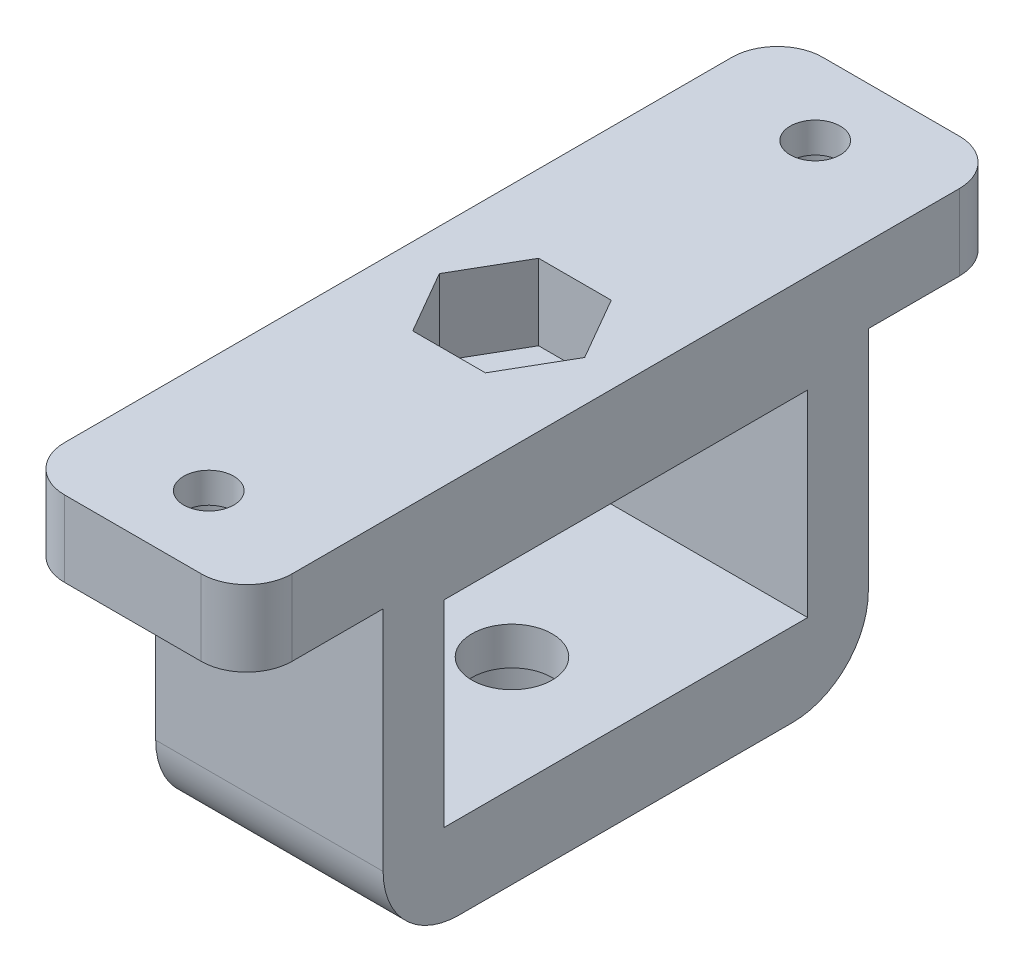
ISO-10303-21;
HEADER;
FILE_DESCRIPTION(('STEP AP214'),'2;1');
FILE_NAME('part.step','',(''),(''),'','','');
FILE_SCHEMA(('AUTOMOTIVE_DESIGN { 1 0 10303 214 1 1 1 1 }'));
ENDSEC;
DATA;
#1=APPLICATION_CONTEXT('core data for automotive mechanical design processes');
#2=APPLICATION_PROTOCOL_DEFINITION('international standard','automotive_design',2000,#1);
#3=PRODUCT_CONTEXT('',#1,'mechanical');
#4=PRODUCT('Part','Part','',(#3));
#5=PRODUCT_RELATED_PRODUCT_CATEGORY('part','',(#4));
#6=PRODUCT_DEFINITION_FORMATION('','',#4);
#7=PRODUCT_DEFINITION_CONTEXT('part definition',#1,'design');
#8=PRODUCT_DEFINITION('design','',#6,#7);
#9=PRODUCT_DEFINITION_SHAPE('','',#8);
#10=(LENGTH_UNIT() NAMED_UNIT(*) SI_UNIT(.MILLI.,.METRE.));
#11=(NAMED_UNIT(*) PLANE_ANGLE_UNIT() SI_UNIT($,.RADIAN.));
#12=(NAMED_UNIT(*) SI_UNIT($,.STERADIAN.) SOLID_ANGLE_UNIT());
#13=UNCERTAINTY_MEASURE_WITH_UNIT(LENGTH_MEASURE(1.E-05),#10,'distance_accuracy_value','');
#14=(GEOMETRIC_REPRESENTATION_CONTEXT(3) GLOBAL_UNCERTAINTY_ASSIGNED_CONTEXT((#13)) GLOBAL_UNIT_ASSIGNED_CONTEXT((#10,
#11,#12)) REPRESENTATION_CONTEXT('',''));
#15=CARTESIAN_POINT('',(0.,0.,0.));
#16=DIRECTION('',(0.,0.,1.));
#17=DIRECTION('',(1.,0.,0.));
#18=AXIS2_PLACEMENT_3D('',#15,#16,#17);
#19=CARTESIAN_POINT('',(-187.5,49.,242.));
#20=DIRECTION('',(0.,0.,1.));
#21=DIRECTION('',(1.,0.,0.));
#22=AXIS2_PLACEMENT_3D('',#19,#20,#21);
#23=PLANE('',#22);
#24=DIRECTION('',(1.,0.,0.));
#25=VECTOR('',#24,1.);
#26=CARTESIAN_POINT('',(-187.5,50.5,242.));
#27=LINE('',#26,#25);
#28=CARTESIAN_POINT('',(-195.,50.5,242.));
#29=VERTEX_POINT('',#28);
#30=CARTESIAN_POINT('',(-180.,50.5,242.));
#31=VERTEX_POINT('',#30);
#32=EDGE_CURVE('E332',#29,#31,#27,.T.);
#33=ORIENTED_EDGE('',*,*,#32,.F.);
#34=DIRECTION('',(0.,1.,0.));
#35=VECTOR('',#34,1.);
#36=CARTESIAN_POINT('',(-195.,49.,242.));
#37=LINE('',#36,#35);
#38=CARTESIAN_POINT('',(-195.,63.5,242.));
#39=VERTEX_POINT('',#38);
#40=EDGE_CURVE('E386',#29,#39,#37,.T.);
#41=ORIENTED_EDGE('',*,*,#40,.T.);
#42=DIRECTION('',(1.,0.,0.));
#43=VECTOR('',#42,1.);
#44=CARTESIAN_POINT('',(-187.5,63.5,242.));
#45=LINE('',#44,#43);
#46=CARTESIAN_POINT('',(-180.,63.5,242.));
#47=VERTEX_POINT('',#46);
#48=EDGE_CURVE('E354',#39,#47,#45,.T.);
#49=ORIENTED_EDGE('',*,*,#48,.T.);
#50=DIRECTION('',(0.,1.,0.));
#51=VECTOR('',#50,1.);
#52=CARTESIAN_POINT('',(-180.,49.,242.));
#53=LINE('',#52,#51);
#54=EDGE_CURVE('E390',#31,#47,#53,.T.);
#55=ORIENTED_EDGE('',*,*,#54,.F.);
#56=EDGE_LOOP('',(#33,#41,#49,#55));
#57=FACE_BOUND('',#56,.T.);
#58=ADVANCED_FACE('F16',(#57),#23,.F.);
#59=CARTESIAN_POINT('',(-187.5,49.,218.));
#60=DIRECTION('',(0.,0.,1.));
#61=DIRECTION('',(1.,0.,0.));
#62=AXIS2_PLACEMENT_3D('',#59,#60,#61);
#63=PLANE('',#62);
#64=DIRECTION('',(0.,1.,0.));
#65=VECTOR('',#64,1.);
#66=CARTESIAN_POINT('',(-195.,49.,218.));
#67=LINE('',#66,#65);
#68=CARTESIAN_POINT('',(-195.,50.5,218.));
#69=VERTEX_POINT('',#68);
#70=CARTESIAN_POINT('',(-195.,63.5,218.));
#71=VERTEX_POINT('',#70);
#72=EDGE_CURVE('E369',#69,#71,#67,.T.);
#73=ORIENTED_EDGE('',*,*,#72,.F.);
#74=DIRECTION('',(1.,0.,0.));
#75=VECTOR('',#74,1.);
#76=CARTESIAN_POINT('',(-187.5,50.5,218.));
#77=LINE('',#76,#75);
#78=CARTESIAN_POINT('',(-180.,50.5,218.));
#79=VERTEX_POINT('',#78);
#80=EDGE_CURVE('E338',#69,#79,#77,.T.);
#81=ORIENTED_EDGE('',*,*,#80,.T.);
#82=DIRECTION('',(0.,1.,0.));
#83=VECTOR('',#82,1.);
#84=CARTESIAN_POINT('',(-180.,49.,218.));
#85=LINE('',#84,#83);
#86=CARTESIAN_POINT('',(-180.,63.5,218.));
#87=VERTEX_POINT('',#86);
#88=EDGE_CURVE('E372',#79,#87,#85,.T.);
#89=ORIENTED_EDGE('',*,*,#88,.T.);
#90=DIRECTION('',(1.,0.,0.));
#91=VECTOR('',#90,1.);
#92=CARTESIAN_POINT('',(-187.5,63.5,218.));
#93=LINE('',#92,#91);
#94=EDGE_CURVE('E346',#71,#87,#93,.T.);
#95=ORIENTED_EDGE('',*,*,#94,.F.);
#96=EDGE_LOOP('',(#73,#81,#89,#95));
#97=FACE_BOUND('',#96,.T.);
#98=ADVANCED_FACE('F628',(#97),#63,.T.);
#99=CARTESIAN_POINT('',(-187.5,65.,195.));
#100=DIRECTION('',(0.,-1.,0.));
#101=DIRECTION('',(1.,0.,0.));
#102=AXIS2_PLACEMENT_3D('',#99,#100,#101);
#103=PLANE('',#102);
#104=CARTESIAN_POINT('',(-187.5,65.,250.));
#105=DIRECTION('',(0.,-1.,0.));
#106=DIRECTION('',(1.,0.,0.));
#107=AXIS2_PLACEMENT_3D('',#104,#105,#106);
#108=CIRCLE('',#107,3.);
#109=CARTESIAN_POINT('',(-184.5,65.,250.));
#110=VERTEX_POINT('',#109);
#111=EDGE_CURVE('E432',#110,#110,#108,.T.);
#112=ORIENTED_EDGE('',*,*,#111,.F.);
#113=EDGE_LOOP('',(#112));
#114=FACE_BOUND('',#113,.T.);
#115=DIRECTION('',(0.,0.,-1.));
#116=VECTOR('',#115,1.);
#117=CARTESIAN_POINT('',(-180.,65.,375.));
#118=LINE('',#117,#116);
#119=CARTESIAN_POINT('',(-180.,65.,252.));
#120=VERTEX_POINT('',#119);
#121=CARTESIAN_POINT('',(-180.,65.,246.));
#122=VERTEX_POINT('',#121);
#123=EDGE_CURVE('E420',#120,#122,#118,.T.);
#124=ORIENTED_EDGE('',*,*,#123,.F.);
#125=CARTESIAN_POINT('',(-183.,65.,252.));
#126=DIRECTION('',(0.,-1.,0.));
#127=DIRECTION('',(0.,0.,-1.));
#128=AXIS2_PLACEMENT_3D('',#125,#126,#127);
#129=CIRCLE('',#128,3.);
#130=CARTESIAN_POINT('',(-183.,65.,255.));
#131=VERTEX_POINT('',#130);
#132=EDGE_CURVE('E512',#120,#131,#129,.T.);
#133=ORIENTED_EDGE('',*,*,#132,.T.);
#134=DIRECTION('',(1.,0.,0.));
#135=VECTOR('',#134,1.);
#136=CARTESIAN_POINT('',(-187.5,65.,255.));
#137=LINE('',#136,#135);
#138=CARTESIAN_POINT('',(-192.,65.,255.));
#139=VERTEX_POINT('',#138);
#140=EDGE_CURVE('E436',#139,#131,#137,.T.);
#141=ORIENTED_EDGE('',*,*,#140,.F.);
#142=CARTESIAN_POINT('',(-192.,65.,252.));
#143=DIRECTION('',(0.,-1.,0.));
#144=DIRECTION('',(0.,0.,-1.));
#145=AXIS2_PLACEMENT_3D('',#142,#143,#144);
#146=CIRCLE('',#145,3.);
#147=CARTESIAN_POINT('',(-195.,65.,252.));
#148=VERTEX_POINT('',#147);
#149=EDGE_CURVE('E509',#139,#148,#146,.T.);
#150=ORIENTED_EDGE('',*,*,#149,.T.);
#151=DIRECTION('',(0.,0.,-1.));
#152=VECTOR('',#151,1.);
#153=CARTESIAN_POINT('',(-195.,65.,375.));
#154=LINE('',#153,#152);
#155=CARTESIAN_POINT('',(-195.,65.,246.));
#156=VERTEX_POINT('',#155);
#157=EDGE_CURVE('E414',#148,#156,#154,.T.);
#158=ORIENTED_EDGE('',*,*,#157,.T.);
#159=DIRECTION('',(1.,0.,0.));
#160=VECTOR('',#159,1.);
#161=CARTESIAN_POINT('',(-187.5,65.,246.));
#162=LINE('',#161,#160);
#163=EDGE_CURVE('E381',#156,#122,#162,.T.);
#164=ORIENTED_EDGE('',*,*,#163,.T.);
#165=EDGE_LOOP('',(#124,#133,#141,#150,#158,#164));
#166=FACE_BOUND('',#165,.T.);
#167=ADVANCED_FACE('F624',(#114,#166),#103,.T.);
#168=CARTESIAN_POINT('',(-195.,65.,375.));
#169=DIRECTION('',(1.,0.,0.));
#170=DIRECTION('',(0.,0.,-1.));
#171=AXIS2_PLACEMENT_3D('',#168,#169,#170);
#172=PLANE('',#171);
#173=DIRECTION('',(0.,0.,-1.));
#174=VECTOR('',#173,1.);
#175=CARTESIAN_POINT('',(-195.,50.5,375.));
#176=LINE('',#175,#174);
#177=EDGE_CURVE('E326',#29,#69,#176,.T.);
#178=ORIENTED_EDGE('',*,*,#177,.T.);
#179=ORIENTED_EDGE('',*,*,#72,.T.);
#180=DIRECTION('',(0.,0.,-1.));
#181=VECTOR('',#180,1.);
#182=CARTESIAN_POINT('',(-195.,63.5,375.));
#183=LINE('',#182,#181);
#184=EDGE_CURVE('E342',#39,#71,#183,.T.);
#185=ORIENTED_EDGE('',*,*,#184,.F.);
#186=ORIENTED_EDGE('',*,*,#40,.F.);
#187=EDGE_LOOP('',(#178,#179,#185,#186));
#188=FACE_BOUND('',#187,.T.);
#189=DIRECTION('',(0.,0.,-1.));
#190=VECTOR('',#189,1.);
#191=CARTESIAN_POINT('',(-195.,45.,375.));
#192=LINE('',#191,#190);
#193=CARTESIAN_POINT('',(-195.,45.,241.));
#194=VERTEX_POINT('',#193);
#195=CARTESIAN_POINT('',(-195.,45.,219.));
#196=VERTEX_POINT('',#195);
#197=EDGE_CURVE('E358',#194,#196,#192,.T.);
#198=ORIENTED_EDGE('',*,*,#197,.F.);
#199=CARTESIAN_POINT('',(-195.,50.,241.));
#200=DIRECTION('',(1.,0.,0.));
#201=DIRECTION('',(0.,0.,-1.));
#202=AXIS2_PLACEMENT_3D('',#199,#200,#201);
#203=CIRCLE('',#202,5.);
#204=CARTESIAN_POINT('',(-195.,50.,246.));
#205=VERTEX_POINT('',#204);
#206=EDGE_CURVE('E25',#194,#205,#203,.F.);
#207=ORIENTED_EDGE('',*,*,#206,.T.);
#208=DIRECTION('',(0.,1.,0.));
#209=VECTOR('',#208,1.);
#210=CARTESIAN_POINT('',(-195.,49.,246.));
#211=LINE('',#210,#209);
#212=EDGE_CURVE('E385',#205,#156,#211,.T.);
#213=ORIENTED_EDGE('',*,*,#212,.T.);
#214=ORIENTED_EDGE('',*,*,#157,.F.);
#215=DIRECTION('',(0.,1.,0.));
#216=VECTOR('',#215,1.);
#217=CARTESIAN_POINT('',(-195.,70.,252.));
#218=LINE('',#217,#216);
#219=CARTESIAN_POINT('',(-195.,70.,252.));
#220=VERTEX_POINT('',#219);
#221=EDGE_CURVE('E482',#148,#220,#218,.T.);
#222=ORIENTED_EDGE('',*,*,#221,.T.);
#223=DIRECTION('',(0.,0.,-1.));
#224=VECTOR('',#223,1.);
#225=CARTESIAN_POINT('',(-195.,70.,375.));
#226=LINE('',#225,#224);
#227=CARTESIAN_POINT('',(-195.,70.,208.));
#228=VERTEX_POINT('',#227);
#229=EDGE_CURVE('E410',#220,#228,#226,.T.);
#230=ORIENTED_EDGE('',*,*,#229,.T.);
#231=DIRECTION('',(0.,1.,0.));
#232=VECTOR('',#231,1.);
#233=CARTESIAN_POINT('',(-195.,65.,208.));
#234=LINE('',#233,#232);
#235=CARTESIAN_POINT('',(-195.,65.,208.));
#236=VERTEX_POINT('',#235);
#237=EDGE_CURVE('E486',#228,#236,#234,.F.);
#238=ORIENTED_EDGE('',*,*,#237,.T.);
#239=CARTESIAN_POINT('',(-195.,65.,214.));
#240=VERTEX_POINT('',#239);
#241=EDGE_CURVE('E419',#240,#236,#154,.T.);
#242=ORIENTED_EDGE('',*,*,#241,.F.);
#243=DIRECTION('',(0.,1.,0.));
#244=VECTOR('',#243,1.);
#245=CARTESIAN_POINT('',(-195.,49.,214.));
#246=LINE('',#245,#244);
#247=CARTESIAN_POINT('',(-195.,50.,214.));
#248=VERTEX_POINT('',#247);
#249=EDGE_CURVE('E378',#248,#240,#246,.T.);
#250=ORIENTED_EDGE('',*,*,#249,.F.);
#251=CARTESIAN_POINT('',(-195.,50.,219.));
#252=DIRECTION('',(1.,0.,0.));
#253=DIRECTION('',(0.,0.,-1.));
#254=AXIS2_PLACEMENT_3D('',#251,#252,#253);
#255=CIRCLE('',#254,5.);
#256=EDGE_CURVE('E45',#248,#196,#255,.F.);
#257=ORIENTED_EDGE('',*,*,#256,.T.);
#258=EDGE_LOOP('',(#198,#207,#213,#214,#222,#230,#238,#242,#250,#257));
#259=FACE_BOUND('',#258,.T.);
#260=ADVANCED_FACE('F537',(#188,#259),#172,.F.);
#261=CARTESIAN_POINT('',(-187.5,65.,205.));
#262=DIRECTION('',(0.,0.,1.));
#263=DIRECTION('',(1.,0.,0.));
#264=AXIS2_PLACEMENT_3D('',#261,#262,#263);
#265=PLANE('',#264);
#266=DIRECTION('',(1.,0.,0.));
#267=VECTOR('',#266,1.);
#268=CARTESIAN_POINT('',(-187.5,65.,205.));
#269=LINE('',#268,#267);
#270=CARTESIAN_POINT('',(-192.,65.,205.));
#271=VERTEX_POINT('',#270);
#272=CARTESIAN_POINT('',(-183.,65.,205.));
#273=VERTEX_POINT('',#272);
#274=EDGE_CURVE('E428',#271,#273,#269,.T.);
#275=ORIENTED_EDGE('',*,*,#274,.F.);
#276=DIRECTION('',(0.,1.,0.));
#277=VECTOR('',#276,1.);
#278=CARTESIAN_POINT('',(-192.,65.,205.));
#279=LINE('',#278,#277);
#280=CARTESIAN_POINT('',(-192.,70.,205.));
#281=VERTEX_POINT('',#280);
#282=EDGE_CURVE('E466',#271,#281,#279,.T.);
#283=ORIENTED_EDGE('',*,*,#282,.T.);
#284=DIRECTION('',(1.,0.,0.));
#285=VECTOR('',#284,1.);
#286=CARTESIAN_POINT('',(-187.5,70.,205.));
#287=LINE('',#286,#285);
#288=CARTESIAN_POINT('',(-183.,70.,205.));
#289=VERTEX_POINT('',#288);
#290=EDGE_CURVE('E448',#281,#289,#287,.T.);
#291=ORIENTED_EDGE('',*,*,#290,.T.);
#292=DIRECTION('',(0.,1.,0.));
#293=VECTOR('',#292,1.);
#294=CARTESIAN_POINT('',(-183.,65.,205.));
#295=LINE('',#294,#293);
#296=EDGE_CURVE('E463',#289,#273,#295,.F.);
#297=ORIENTED_EDGE('',*,*,#296,.T.);
#298=EDGE_LOOP('',(#275,#283,#291,#297));
#299=FACE_BOUND('',#298,.T.);
#300=ADVANCED_FACE('F615',(#299),#265,.F.);
#301=CARTESIAN_POINT('',(-180.,65.,375.));
#302=DIRECTION('',(1.,0.,0.));
#303=DIRECTION('',(0.,0.,-1.));
#304=AXIS2_PLACEMENT_3D('',#301,#302,#303);
#305=PLANE('',#304);
#306=DIRECTION('',(0.,0.,-1.));
#307=VECTOR('',#306,1.);
#308=CARTESIAN_POINT('',(-180.,50.5,375.));
#309=LINE('',#308,#307);
#310=EDGE_CURVE('E335',#31,#79,#309,.T.);
#311=ORIENTED_EDGE('',*,*,#310,.F.);
#312=ORIENTED_EDGE('',*,*,#54,.T.);
#313=DIRECTION('',(0.,0.,-1.));
#314=VECTOR('',#313,1.);
#315=CARTESIAN_POINT('',(-180.,63.5,375.));
#316=LINE('',#315,#314);
#317=EDGE_CURVE('E350',#47,#87,#316,.T.);
#318=ORIENTED_EDGE('',*,*,#317,.T.);
#319=ORIENTED_EDGE('',*,*,#88,.F.);
#320=EDGE_LOOP('',(#311,#312,#318,#319));
#321=FACE_BOUND('',#320,.T.);
#322=DIRECTION('',(0.,1.,0.));
#323=VECTOR('',#322,1.);
#324=CARTESIAN_POINT('',(-180.,49.,246.));
#325=LINE('',#324,#323);
#326=CARTESIAN_POINT('',(-180.,50.,246.));
#327=VERTEX_POINT('',#326);
#328=EDGE_CURVE('E393',#327,#122,#325,.T.);
#329=ORIENTED_EDGE('',*,*,#328,.F.);
#330=CARTESIAN_POINT('',(-180.,50.,241.));
#331=DIRECTION('',(1.,0.,0.));
#332=DIRECTION('',(0.,0.,-1.));
#333=AXIS2_PLACEMENT_3D('',#330,#331,#332);
#334=CIRCLE('',#333,5.);
#335=CARTESIAN_POINT('',(-180.,45.,241.));
#336=VERTEX_POINT('',#335);
#337=EDGE_CURVE('E522',#327,#336,#334,.T.);
#338=ORIENTED_EDGE('',*,*,#337,.T.);
#339=DIRECTION('',(0.,0.,-1.));
#340=VECTOR('',#339,1.);
#341=CARTESIAN_POINT('',(-180.,45.,375.));
#342=LINE('',#341,#340);
#343=CARTESIAN_POINT('',(-180.,45.,219.));
#344=VERTEX_POINT('',#343);
#345=EDGE_CURVE('E361',#336,#344,#342,.T.);
#346=ORIENTED_EDGE('',*,*,#345,.T.);
#347=CARTESIAN_POINT('',(-180.,50.,219.));
#348=DIRECTION('',(1.,0.,0.));
#349=DIRECTION('',(0.,0.,-1.));
#350=AXIS2_PLACEMENT_3D('',#347,#348,#349);
#351=CIRCLE('',#350,5.);
#352=CARTESIAN_POINT('',(-180.,50.,214.));
#353=VERTEX_POINT('',#352);
#354=EDGE_CURVE('E519',#344,#353,#351,.T.);
#355=ORIENTED_EDGE('',*,*,#354,.T.);
#356=DIRECTION('',(0.,1.,0.));
#357=VECTOR('',#356,1.);
#358=CARTESIAN_POINT('',(-180.,49.,214.));
#359=LINE('',#358,#357);
#360=CARTESIAN_POINT('',(-180.,65.,214.));
#361=VERTEX_POINT('',#360);
#362=EDGE_CURVE('E375',#353,#361,#359,.T.);
#363=ORIENTED_EDGE('',*,*,#362,.T.);
#364=CARTESIAN_POINT('',(-180.,65.,208.));
#365=VERTEX_POINT('',#364);
#366=EDGE_CURVE('E418',#361,#365,#118,.T.);
#367=ORIENTED_EDGE('',*,*,#366,.T.);
#368=DIRECTION('',(0.,1.,0.));
#369=VECTOR('',#368,1.);
#370=CARTESIAN_POINT('',(-180.,70.,208.));
#371=LINE('',#370,#369);
#372=CARTESIAN_POINT('',(-180.,70.,208.));
#373=VERTEX_POINT('',#372);
#374=EDGE_CURVE('E498',#365,#373,#371,.T.);
#375=ORIENTED_EDGE('',*,*,#374,.T.);
#376=DIRECTION('',(0.,0.,-1.));
#377=VECTOR('',#376,1.);
#378=CARTESIAN_POINT('',(-180.,70.,375.));
#379=LINE('',#378,#377);
#380=CARTESIAN_POINT('',(-180.,70.,252.));
#381=VERTEX_POINT('',#380);
#382=EDGE_CURVE('E444',#381,#373,#379,.T.);
#383=ORIENTED_EDGE('',*,*,#382,.F.);
#384=DIRECTION('',(0.,1.,0.));
#385=VECTOR('',#384,1.);
#386=CARTESIAN_POINT('',(-180.,65.,252.));
#387=LINE('',#386,#385);
#388=EDGE_CURVE('E495',#381,#120,#387,.F.);
#389=ORIENTED_EDGE('',*,*,#388,.T.);
#390=ORIENTED_EDGE('',*,*,#123,.T.);
#391=EDGE_LOOP('',(#329,#338,#346,#355,#363,#367,#375,#383,#389,#390));
#392=FACE_BOUND('',#391,.T.);
#393=ADVANCED_FACE('F549',(#321,#392),#305,.T.);
#394=CARTESIAN_POINT('',(-187.5,65.,250.));
#395=DIRECTION('',(0.,1.,0.));
#396=DIRECTION('',(0.,0.,1.));
#397=AXIS2_PLACEMENT_3D('',#394,#395,#396);
#398=CYLINDRICAL_SURFACE('',#397,3.);
#399=CARTESIAN_POINT('',(-187.5,68.,250.));
#400=DIRECTION('',(0.,-1.,0.));
#401=DIRECTION('',(0.,0.,-1.));
#402=AXIS2_PLACEMENT_3D('',#399,#400,#401);
#403=CIRCLE('',#402,3.);
#404=CARTESIAN_POINT('',(-187.5,68.,247.));
#405=VERTEX_POINT('',#404);
#406=EDGE_CURVE('E440',#405,#405,#403,.T.);
#407=ORIENTED_EDGE('',*,*,#406,.F.);
#408=EDGE_LOOP('',(#407));
#409=FACE_BOUND('',#408,.T.);
#410=ORIENTED_EDGE('',*,*,#111,.T.);
#411=EDGE_LOOP('',(#410));
#412=FACE_BOUND('',#411,.T.);
#413=ADVANCED_FACE('F609',(#409,#412),#398,.F.);
#414=CARTESIAN_POINT('',(-187.5,65.,255.));
#415=DIRECTION('',(0.,0.,1.));
#416=DIRECTION('',(1.,0.,0.));
#417=AXIS2_PLACEMENT_3D('',#414,#415,#416);
#418=PLANE('',#417);
#419=ORIENTED_EDGE('',*,*,#140,.T.);
#420=DIRECTION('',(0.,1.,0.));
#421=VECTOR('',#420,1.);
#422=CARTESIAN_POINT('',(-183.,65.,255.));
#423=LINE('',#422,#421);
#424=CARTESIAN_POINT('',(-183.,70.,255.));
#425=VERTEX_POINT('',#424);
#426=EDGE_CURVE('E505',#131,#425,#423,.T.);
#427=ORIENTED_EDGE('',*,*,#426,.T.);
#428=DIRECTION('',(1.,0.,0.));
#429=VECTOR('',#428,1.);
#430=CARTESIAN_POINT('',(-187.5,70.,255.));
#431=LINE('',#430,#429);
#432=CARTESIAN_POINT('',(-192.,70.,255.));
#433=VERTEX_POINT('',#432);
#434=EDGE_CURVE('E452',#433,#425,#431,.T.);
#435=ORIENTED_EDGE('',*,*,#434,.F.);
#436=DIRECTION('',(0.,1.,0.));
#437=VECTOR('',#436,1.);
#438=CARTESIAN_POINT('',(-192.,65.,255.));
#439=LINE('',#438,#437);
#440=EDGE_CURVE('E502',#433,#139,#439,.F.);
#441=ORIENTED_EDGE('',*,*,#440,.T.);
#442=EDGE_LOOP('',(#419,#427,#435,#441));
#443=FACE_BOUND('',#442,.T.);
#444=ADVANCED_FACE('F604',(#443),#418,.T.);
#445=CARTESIAN_POINT('',(-187.5,65.,210.));
#446=DIRECTION('',(0.,1.,0.));
#447=DIRECTION('',(0.,0.,1.));
#448=AXIS2_PLACEMENT_3D('',#445,#446,#447);
#449=CYLINDRICAL_SURFACE('',#448,3.);
#450=CARTESIAN_POINT('',(-187.5,68.,210.));
#451=DIRECTION('',(0.,-1.,0.));
#452=DIRECTION('',(0.,0.,-1.));
#453=AXIS2_PLACEMENT_3D('',#450,#451,#452);
#454=CIRCLE('',#453,3.);
#455=CARTESIAN_POINT('',(-187.5,68.,207.));
#456=VERTEX_POINT('',#455);
#457=EDGE_CURVE('E459',#456,#456,#454,.T.);
#458=ORIENTED_EDGE('',*,*,#457,.F.);
#459=EDGE_LOOP('',(#458));
#460=FACE_BOUND('',#459,.T.);
#461=CARTESIAN_POINT('',(-187.5,65.,210.));
#462=DIRECTION('',(0.,-1.,0.));
#463=DIRECTION('',(1.,0.,0.));
#464=AXIS2_PLACEMENT_3D('',#461,#462,#463);
#465=CIRCLE('',#464,3.);
#466=CARTESIAN_POINT('',(-184.5,65.,210.));
#467=VERTEX_POINT('',#466);
#468=EDGE_CURVE('E424',#467,#467,#465,.T.);
#469=ORIENTED_EDGE('',*,*,#468,.T.);
#470=EDGE_LOOP('',(#469));
#471=FACE_BOUND('',#470,.T.);
#472=ADVANCED_FACE('F608',(#460,#471),#449,.F.);
#473=ORIENTED_EDGE('',*,*,#241,.T.);
#474=CARTESIAN_POINT('',(-192.,65.,208.));
#475=DIRECTION('',(0.,-1.,0.));
#476=DIRECTION('',(0.,0.,-1.));
#477=AXIS2_PLACEMENT_3D('',#474,#475,#476);
#478=CIRCLE('',#477,3.);
#479=EDGE_CURVE('E492',#236,#271,#478,.T.);
#480=ORIENTED_EDGE('',*,*,#479,.T.);
#481=ORIENTED_EDGE('',*,*,#274,.T.);
#482=CARTESIAN_POINT('',(-183.,65.,208.));
#483=DIRECTION('',(0.,-1.,0.));
#484=DIRECTION('',(0.,0.,-1.));
#485=AXIS2_PLACEMENT_3D('',#482,#483,#484);
#486=CIRCLE('',#485,3.);
#487=EDGE_CURVE('E489',#273,#365,#486,.T.);
#488=ORIENTED_EDGE('',*,*,#487,.T.);
#489=ORIENTED_EDGE('',*,*,#366,.F.);
#490=DIRECTION('',(1.,0.,0.));
#491=VECTOR('',#490,1.);
#492=CARTESIAN_POINT('',(-187.5,65.,214.));
#493=LINE('',#492,#491);
#494=EDGE_CURVE('E365',#240,#361,#493,.T.);
#495=ORIENTED_EDGE('',*,*,#494,.F.);
#496=EDGE_LOOP('',(#473,#480,#481,#488,#489,#495));
#497=FACE_BOUND('',#496,.T.);
#498=ORIENTED_EDGE('',*,*,#468,.F.);
#499=EDGE_LOOP('',(#498));
#500=FACE_BOUND('',#499,.T.);
#501=ADVANCED_FACE('F561',(#497,#500),#103,.T.);
#502=CARTESIAN_POINT('',(-187.5,70.,195.));
#503=DIRECTION('',(0.,-1.,0.));
#504=DIRECTION('',(1.,0.,0.));
#505=AXIS2_PLACEMENT_3D('',#502,#503,#504);
#506=PLANE('',#505);
#507=DIRECTION('',(1.,0.,0.));
#508=VECTOR('',#507,1.);
#509=CARTESIAN_POINT('',(-185.416651174618,70.,234.15));
#510=LINE('',#509,#508);
#511=CARTESIAN_POINT('',(-189.896003617137,70.,234.15));
#512=VERTEX_POINT('',#511);
#513=CARTESIAN_POINT('',(-185.103996382863,70.,234.15));
#514=VERTEX_POINT('',#513);
#515=EDGE_CURVE('E294',#512,#514,#510,.T.);
#516=ORIENTED_EDGE('',*,*,#515,.F.);
#517=DIRECTION('',(0.5,0.,0.866025403784439));
#518=VECTOR('',#517,1.);
#519=CARTESIAN_POINT('',(-191.615240356961,70.,231.172194616385));
#520=LINE('',#519,#518);
#521=CARTESIAN_POINT('',(-192.292007234274,70.,230.));
#522=VERTEX_POINT('',#521);
#523=EDGE_CURVE('E279',#522,#512,#520,.T.);
#524=ORIENTED_EDGE('',*,*,#523,.F.);
#525=DIRECTION('',(-0.5,0.,0.866025403784439));
#526=VECTOR('',#525,1.);
#527=CARTESIAN_POINT('',(-191.326344567764,70.,228.327423198633));
#528=LINE('',#527,#526);
#529=CARTESIAN_POINT('',(-189.896003617137,70.,225.85));
#530=VERTEX_POINT('',#529);
#531=EDGE_CURVE('E238',#530,#522,#528,.T.);
#532=ORIENTED_EDGE('',*,*,#531,.F.);
#533=DIRECTION('',(-1.,0.,0.));
#534=VECTOR('',#533,1.);
#535=CARTESIAN_POINT('',(-189.00714814663,70.,225.85));
#536=LINE('',#535,#534);
#537=CARTESIAN_POINT('',(-185.103996382863,70.,225.85));
#538=VERTEX_POINT('',#537);
#539=EDGE_CURVE('E282',#538,#530,#536,.T.);
#540=ORIENTED_EDGE('',*,*,#539,.F.);
#541=DIRECTION('',(-0.5,0.,-0.866025403784439));
#542=VECTOR('',#541,1.);
#543=CARTESIAN_POINT('',(-182.278157097093,70.,230.744497216977));
#544=LINE('',#543,#542);
#545=CARTESIAN_POINT('',(-182.707992765726,70.,230.));
#546=VERTEX_POINT('',#545);
#547=EDGE_CURVE('E286',#546,#538,#544,.T.);
#548=ORIENTED_EDGE('',*,*,#547,.F.);
#549=DIRECTION('',(0.5,0.,-0.866025403784438));
#550=VECTOR('',#549,1.);
#551=CARTESIAN_POINT('',(-182.104296934139,70.,228.954368147375));
#552=LINE('',#551,#550);
#553=EDGE_CURVE('E290',#514,#546,#552,.T.);
#554=ORIENTED_EDGE('',*,*,#553,.F.);
#555=EDGE_LOOP('',(#516,#524,#532,#540,#548,#554));
#556=FACE_BOUND('',#555,.T.);
#557=ORIENTED_EDGE('',*,*,#290,.F.);
#558=CARTESIAN_POINT('',(-192.,70.,208.));
#559=DIRECTION('',(0.,-1.,0.));
#560=DIRECTION('',(0.,0.,-1.));
#561=AXIS2_PLACEMENT_3D('',#558,#559,#560);
#562=CIRCLE('',#561,3.);
#563=EDGE_CURVE('E479',#281,#228,#562,.F.);
#564=ORIENTED_EDGE('',*,*,#563,.T.);
#565=ORIENTED_EDGE('',*,*,#229,.F.);
#566=CARTESIAN_POINT('',(-192.,70.,252.));
#567=DIRECTION('',(0.,-1.,0.));
#568=DIRECTION('',(0.,0.,-1.));
#569=AXIS2_PLACEMENT_3D('',#566,#567,#568);
#570=CIRCLE('',#569,3.);
#571=EDGE_CURVE('E470',#220,#433,#570,.F.);
#572=ORIENTED_EDGE('',*,*,#571,.T.);
#573=ORIENTED_EDGE('',*,*,#434,.T.);
#574=CARTESIAN_POINT('',(-183.,70.,252.));
#575=DIRECTION('',(0.,-1.,0.));
#576=DIRECTION('',(0.,0.,-1.));
#577=AXIS2_PLACEMENT_3D('',#574,#575,#576);
#578=CIRCLE('',#577,3.);
#579=EDGE_CURVE('E473',#425,#381,#578,.F.);
#580=ORIENTED_EDGE('',*,*,#579,.T.);
#581=ORIENTED_EDGE('',*,*,#382,.T.);
#582=CARTESIAN_POINT('',(-183.,70.,208.));
#583=DIRECTION('',(0.,-1.,0.));
#584=DIRECTION('',(0.,0.,-1.));
#585=AXIS2_PLACEMENT_3D('',#582,#583,#584);
#586=CIRCLE('',#585,3.);
#587=EDGE_CURVE('E476',#373,#289,#586,.F.);
#588=ORIENTED_EDGE('',*,*,#587,.T.);
#589=EDGE_LOOP('',(#557,#564,#565,#572,#573,#580,#581,#588));
#590=FACE_BOUND('',#589,.T.);
#591=CARTESIAN_POINT('',(-187.5,70.,250.));
#592=DIRECTION('',(0.,-1.,0.));
#593=DIRECTION('',(1.,0.,0.));
#594=AXIS2_PLACEMENT_3D('',#591,#592,#593);
#595=CIRCLE('',#594,1.65);
#596=CARTESIAN_POINT('',(-185.85,70.,250.));
#597=VERTEX_POINT('',#596);
#598=EDGE_CURVE('E402',#597,#597,#595,.T.);
#599=ORIENTED_EDGE('',*,*,#598,.T.);
#600=EDGE_LOOP('',(#599));
#601=FACE_BOUND('',#600,.T.);
#602=CARTESIAN_POINT('',(-187.5,70.,210.));
#603=DIRECTION('',(0.,-1.,0.));
#604=DIRECTION('',(1.,0.,0.));
#605=AXIS2_PLACEMENT_3D('',#602,#603,#604);
#606=CIRCLE('',#605,1.65);
#607=CARTESIAN_POINT('',(-185.85,70.,210.));
#608=VERTEX_POINT('',#607);
#609=EDGE_CURVE('E389',#608,#608,#606,.T.);
#610=ORIENTED_EDGE('',*,*,#609,.T.);
#611=EDGE_LOOP('',(#610));
#612=FACE_BOUND('',#611,.T.);
#613=ADVANCED_FACE('F636',(#556,#590,#601,#612),#506,.F.);
#614=CARTESIAN_POINT('',(-187.5,68.,250.));
#615=DIRECTION('',(0.,1.,0.));
#616=DIRECTION('',(0.,0.,1.));
#617=AXIS2_PLACEMENT_3D('',#614,#615,#616);
#618=CYLINDRICAL_SURFACE('',#617,1.65);
#619=CARTESIAN_POINT('',(-187.5,68.,250.));
#620=DIRECTION('',(0.,-1.,0.));
#621=DIRECTION('',(1.,0.,0.));
#622=AXIS2_PLACEMENT_3D('',#619,#620,#621);
#623=CIRCLE('',#622,1.65);
#624=CARTESIAN_POINT('',(-185.85,68.,250.));
#625=VERTEX_POINT('',#624);
#626=EDGE_CURVE('E406',#625,#625,#623,.T.);
#627=ORIENTED_EDGE('',*,*,#626,.T.);
#628=EDGE_LOOP('',(#627));
#629=FACE_BOUND('',#628,.T.);
#630=ORIENTED_EDGE('',*,*,#598,.F.);
#631=EDGE_LOOP('',(#630));
#632=FACE_BOUND('',#631,.T.);
#633=ADVANCED_FACE('F640',(#629,#632),#618,.F.);
#634=CARTESIAN_POINT('',(-187.5,68.,195.));
#635=DIRECTION('',(0.,-1.,0.));
#636=DIRECTION('',(1.,0.,0.));
#637=AXIS2_PLACEMENT_3D('',#634,#635,#636);
#638=PLANE('',#637);
#639=ORIENTED_EDGE('',*,*,#626,.F.);
#640=EDGE_LOOP('',(#639));
#641=FACE_BOUND('',#640,.T.);
#642=ORIENTED_EDGE('',*,*,#406,.T.);
#643=EDGE_LOOP('',(#642));
#644=FACE_BOUND('',#643,.T.);
#645=ADVANCED_FACE('F653',(#641,#644),#638,.T.);
#646=CARTESIAN_POINT('',(-187.5,68.,210.));
#647=DIRECTION('',(0.,1.,0.));
#648=DIRECTION('',(0.,0.,1.));
#649=AXIS2_PLACEMENT_3D('',#646,#647,#648);
#650=CYLINDRICAL_SURFACE('',#649,1.65);
#651=CARTESIAN_POINT('',(-187.5,68.,210.));
#652=DIRECTION('',(0.,-1.,0.));
#653=DIRECTION('',(1.,0.,0.));
#654=AXIS2_PLACEMENT_3D('',#651,#652,#653);
#655=CIRCLE('',#654,1.65);
#656=CARTESIAN_POINT('',(-185.85,68.,210.));
#657=VERTEX_POINT('',#656);
#658=EDGE_CURVE('E398',#657,#657,#655,.T.);
#659=ORIENTED_EDGE('',*,*,#658,.T.);
#660=EDGE_LOOP('',(#659));
#661=FACE_BOUND('',#660,.T.);
#662=ORIENTED_EDGE('',*,*,#609,.F.);
#663=EDGE_LOOP('',(#662));
#664=FACE_BOUND('',#663,.T.);
#665=ADVANCED_FACE('F660',(#661,#664),#650,.F.);
#666=CARTESIAN_POINT('',(-187.5,68.,195.));
#667=DIRECTION('',(0.,-1.,0.));
#668=DIRECTION('',(1.,0.,0.));
#669=AXIS2_PLACEMENT_3D('',#666,#667,#668);
#670=PLANE('',#669);
#671=ORIENTED_EDGE('',*,*,#658,.F.);
#672=EDGE_LOOP('',(#671));
#673=FACE_BOUND('',#672,.T.);
#674=ORIENTED_EDGE('',*,*,#457,.T.);
#675=EDGE_LOOP('',(#674));
#676=FACE_BOUND('',#675,.T.);
#677=ADVANCED_FACE('F667',(#673,#676),#670,.T.);
#678=CARTESIAN_POINT('',(-187.5,49.,246.));
#679=DIRECTION('',(0.,0.,1.));
#680=DIRECTION('',(1.,0.,0.));
#681=AXIS2_PLACEMENT_3D('',#678,#679,#680);
#682=PLANE('',#681);
#683=ORIENTED_EDGE('',*,*,#212,.F.);
#684=DIRECTION('',(1.,0.,0.));
#685=VECTOR('',#684,1.);
#686=CARTESIAN_POINT('',(-187.5,50.,246.));
#687=LINE('',#686,#685);
#688=EDGE_CURVE('E515',#205,#327,#687,.T.);
#689=ORIENTED_EDGE('',*,*,#688,.T.);
#690=ORIENTED_EDGE('',*,*,#328,.T.);
#691=ORIENTED_EDGE('',*,*,#163,.F.);
#692=EDGE_LOOP('',(#683,#689,#690,#691));
#693=FACE_BOUND('',#692,.T.);
#694=ADVANCED_FACE('F544',(#693),#682,.T.);
#695=CARTESIAN_POINT('',(-187.5,49.,214.));
#696=DIRECTION('',(0.,0.,1.));
#697=DIRECTION('',(1.,0.,0.));
#698=AXIS2_PLACEMENT_3D('',#695,#696,#697);
#699=PLANE('',#698);
#700=ORIENTED_EDGE('',*,*,#362,.F.);
#701=DIRECTION('',(1.,0.,0.));
#702=VECTOR('',#701,1.);
#703=CARTESIAN_POINT('',(-195.,50.,214.));
#704=LINE('',#703,#702);
#705=EDGE_CURVE('E10',#353,#248,#704,.F.);
#706=ORIENTED_EDGE('',*,*,#705,.T.);
#707=ORIENTED_EDGE('',*,*,#249,.T.);
#708=ORIENTED_EDGE('',*,*,#494,.T.);
#709=EDGE_LOOP('',(#700,#706,#707,#708));
#710=FACE_BOUND('',#709,.T.);
#711=ADVANCED_FACE('F556',(#710),#699,.F.);
#712=CARTESIAN_POINT('',(-187.5,45.,230.));
#713=DIRECTION('',(0.,-1.,0.));
#714=DIRECTION('',(1.,0.,0.));
#715=AXIS2_PLACEMENT_3D('',#712,#713,#714);
#716=PLANE('',#715);
#717=CARTESIAN_POINT('',(-187.5,45.,230.));
#718=DIRECTION('',(0.,-1.,0.));
#719=DIRECTION('',(1.,0.,0.));
#720=AXIS2_PLACEMENT_3D('',#717,#718,#719);
#721=CIRCLE('',#720,4.75);
#722=CARTESIAN_POINT('',(-182.75,45.,230.));
#723=VERTEX_POINT('',#722);
#724=EDGE_CURVE('E321',#723,#723,#721,.T.);
#725=ORIENTED_EDGE('',*,*,#724,.F.);
#726=EDGE_LOOP('',(#725));
#727=FACE_BOUND('',#726,.T.);
#728=ORIENTED_EDGE('',*,*,#345,.F.);
#729=DIRECTION('',(1.,0.,0.));
#730=VECTOR('',#729,1.);
#731=CARTESIAN_POINT('',(-187.5,45.,241.));
#732=LINE('',#731,#730);
#733=EDGE_CURVE('E529',#336,#194,#732,.F.);
#734=ORIENTED_EDGE('',*,*,#733,.T.);
#735=ORIENTED_EDGE('',*,*,#197,.T.);
#736=DIRECTION('',(1.,0.,0.));
#737=VECTOR('',#736,1.);
#738=CARTESIAN_POINT('',(-180.,45.,219.));
#739=LINE('',#738,#737);
#740=EDGE_CURVE('E525',#196,#344,#739,.T.);
#741=ORIENTED_EDGE('',*,*,#740,.T.);
#742=EDGE_LOOP('',(#728,#734,#735,#741));
#743=FACE_BOUND('',#742,.T.);
#744=ADVANCED_FACE('F551',(#727,#743),#716,.T.);
#745=CARTESIAN_POINT('',(-187.5,63.5,195.));
#746=DIRECTION('',(0.,-1.,0.));
#747=DIRECTION('',(1.,0.,0.));
#748=AXIS2_PLACEMENT_3D('',#745,#746,#747);
#749=PLANE('',#748);
#750=CARTESIAN_POINT('',(-187.5,63.5,230.));
#751=DIRECTION('',(0.,-1.,0.));
#752=DIRECTION('',(0.,0.,-1.));
#753=AXIS2_PLACEMENT_3D('',#750,#751,#752);
#754=CIRCLE('',#753,2.65);
#755=CARTESIAN_POINT('',(-187.5,63.5,227.35));
#756=VERTEX_POINT('',#755);
#757=EDGE_CURVE('E317',#756,#756,#754,.T.);
#758=ORIENTED_EDGE('',*,*,#757,.F.);
#759=EDGE_LOOP('',(#758));
#760=FACE_BOUND('',#759,.T.);
#761=ORIENTED_EDGE('',*,*,#184,.T.);
#762=ORIENTED_EDGE('',*,*,#94,.T.);
#763=ORIENTED_EDGE('',*,*,#317,.F.);
#764=ORIENTED_EDGE('',*,*,#48,.F.);
#765=EDGE_LOOP('',(#761,#762,#763,#764));
#766=FACE_BOUND('',#765,.T.);
#767=ADVANCED_FACE('F691',(#760,#766),#749,.T.);
#768=CARTESIAN_POINT('',(-187.5,50.5,230.));
#769=DIRECTION('',(0.,-1.,0.));
#770=DIRECTION('',(1.,0.,0.));
#771=AXIS2_PLACEMENT_3D('',#768,#769,#770);
#772=PLANE('',#771);
#773=CARTESIAN_POINT('',(-187.5,50.5,230.));
#774=DIRECTION('',(0.,-1.,0.));
#775=DIRECTION('',(0.,0.,-1.));
#776=AXIS2_PLACEMENT_3D('',#773,#774,#775);
#777=CIRCLE('',#776,2.65);
#778=CARTESIAN_POINT('',(-187.5,50.5,227.35));
#779=VERTEX_POINT('',#778);
#780=EDGE_CURVE('E313',#779,#779,#777,.T.);
#781=ORIENTED_EDGE('',*,*,#780,.T.);
#782=EDGE_LOOP('',(#781));
#783=FACE_BOUND('',#782,.T.);
#784=ORIENTED_EDGE('',*,*,#177,.F.);
#785=ORIENTED_EDGE('',*,*,#32,.T.);
#786=ORIENTED_EDGE('',*,*,#310,.T.);
#787=ORIENTED_EDGE('',*,*,#80,.F.);
#788=EDGE_LOOP('',(#784,#785,#786,#787));
#789=FACE_BOUND('',#788,.T.);
#790=ADVANCED_FACE('F699',(#783,#789),#772,.F.);
#791=CARTESIAN_POINT('',(-187.5,48.,230.));
#792=DIRECTION('',(0.,-1.,0.));
#793=DIRECTION('',(0.,0.,-1.));
#794=AXIS2_PLACEMENT_3D('',#791,#792,#793);
#795=CYLINDRICAL_SURFACE('',#794,4.75);
#796=CARTESIAN_POINT('',(-187.5,48.,230.));
#797=DIRECTION('',(0.,-1.,0.));
#798=DIRECTION('',(1.,0.,0.));
#799=AXIS2_PLACEMENT_3D('',#796,#797,#798);
#800=CIRCLE('',#799,4.75);
#801=CARTESIAN_POINT('',(-182.75,48.,230.));
#802=VERTEX_POINT('',#801);
#803=EDGE_CURVE('E322',#802,#802,#800,.T.);
#804=ORIENTED_EDGE('',*,*,#803,.F.);
#805=EDGE_LOOP('',(#804));
#806=FACE_BOUND('',#805,.T.);
#807=ORIENTED_EDGE('',*,*,#724,.T.);
#808=EDGE_LOOP('',(#807));
#809=FACE_BOUND('',#808,.T.);
#810=ADVANCED_FACE('F706',(#806,#809),#795,.F.);
#811=CARTESIAN_POINT('',(-187.5,48.,230.));
#812=DIRECTION('',(0.,-1.,0.));
#813=DIRECTION('',(1.,0.,0.));
#814=AXIS2_PLACEMENT_3D('',#811,#812,#813);
#815=PLANE('',#814);
#816=CARTESIAN_POINT('',(-187.5,48.,230.));
#817=DIRECTION('',(0.,-1.,0.));
#818=DIRECTION('',(0.,0.,-1.));
#819=AXIS2_PLACEMENT_3D('',#816,#817,#818);
#820=CIRCLE('',#819,2.65);
#821=CARTESIAN_POINT('',(-187.5,48.,227.35));
#822=VERTEX_POINT('',#821);
#823=EDGE_CURVE('E242',#822,#822,#820,.T.);
#824=ORIENTED_EDGE('',*,*,#823,.F.);
#825=EDGE_LOOP('',(#824));
#826=FACE_BOUND('',#825,.T.);
#827=ORIENTED_EDGE('',*,*,#803,.T.);
#828=EDGE_LOOP('',(#827));
#829=FACE_BOUND('',#828,.T.);
#830=ADVANCED_FACE('F713',(#826,#829),#815,.T.);
#831=CARTESIAN_POINT('',(-187.5,70.002,230.));
#832=DIRECTION('',(0.,-1.,0.));
#833=DIRECTION('',(0.,0.,-1.));
#834=AXIS2_PLACEMENT_3D('',#831,#832,#833);
#835=CYLINDRICAL_SURFACE('',#834,2.65);
#836=ORIENTED_EDGE('',*,*,#823,.T.);
#837=EDGE_LOOP('',(#836));
#838=FACE_BOUND('',#837,.T.);
#839=ORIENTED_EDGE('',*,*,#780,.F.);
#840=EDGE_LOOP('',(#839));
#841=FACE_BOUND('',#840,.T.);
#842=ADVANCED_FACE('F720',(#838,#841),#835,.F.);
#843=CARTESIAN_POINT('',(-187.5,65.,230.));
#844=DIRECTION('',(0.,-1.,0.));
#845=DIRECTION('',(1.,0.,0.));
#846=AXIS2_PLACEMENT_3D('',#843,#844,#845);
#847=CIRCLE('',#846,2.65);
#848=CARTESIAN_POINT('',(-184.85,65.,230.));
#849=VERTEX_POINT('',#848);
#850=EDGE_CURVE('E254',#849,#849,#847,.T.);
#851=ORIENTED_EDGE('',*,*,#850,.F.);
#852=EDGE_LOOP('',(#851));
#853=FACE_BOUND('',#852,.T.);
#854=ORIENTED_EDGE('',*,*,#757,.T.);
#855=EDGE_LOOP('',(#854));
#856=FACE_BOUND('',#855,.T.);
#857=ADVANCED_FACE('F727',(#853,#856),#835,.F.);
#858=CARTESIAN_POINT('',(-191.615240356961,65.,231.172194616385));
#859=DIRECTION('',(-0.866025403784439,0.,0.5));
#860=DIRECTION('',(0.5,0.,0.866025403784439));
#861=AXIS2_PLACEMENT_3D('',#858,#859,#860);
#862=PLANE('',#861);
#863=ORIENTED_EDGE('',*,*,#523,.T.);
#864=DIRECTION('',(0.,1.,0.));
#865=VECTOR('',#864,1.);
#866=CARTESIAN_POINT('',(-189.896003617137,65.,234.15));
#867=LINE('',#866,#865);
#868=CARTESIAN_POINT('',(-189.896003617137,65.,234.15));
#869=VERTEX_POINT('',#868);
#870=EDGE_CURVE('E249',#869,#512,#867,.T.);
#871=ORIENTED_EDGE('',*,*,#870,.F.);
#872=DIRECTION('',(0.5,0.,0.866025403784439));
#873=VECTOR('',#872,1.);
#874=CARTESIAN_POINT('',(-191.615240356961,65.,231.172194616385));
#875=LINE('',#874,#873);
#876=CARTESIAN_POINT('',(-192.292007234274,65.,230.));
#877=VERTEX_POINT('',#876);
#878=EDGE_CURVE('E246',#877,#869,#875,.T.);
#879=ORIENTED_EDGE('',*,*,#878,.F.);
#880=DIRECTION('',(0.,1.,0.));
#881=VECTOR('',#880,1.);
#882=CARTESIAN_POINT('',(-192.292007234274,65.,230.));
#883=LINE('',#882,#881);
#884=EDGE_CURVE('E231',#877,#522,#883,.T.);
#885=ORIENTED_EDGE('',*,*,#884,.T.);
#886=EDGE_LOOP('',(#863,#871,#879,#885));
#887=FACE_BOUND('',#886,.T.);
#888=ADVANCED_FACE('F247',(#887),#862,.F.);
#889=CARTESIAN_POINT('',(-191.326344567764,65.,228.327423198633));
#890=DIRECTION('',(-0.866025403784439,0.,-0.5));
#891=DIRECTION('',(-0.5,0.,0.866025403784439));
#892=AXIS2_PLACEMENT_3D('',#889,#890,#891);
#893=PLANE('',#892);
#894=ORIENTED_EDGE('',*,*,#531,.T.);
#895=ORIENTED_EDGE('',*,*,#884,.F.);
#896=DIRECTION('',(-0.5,0.,0.866025403784439));
#897=VECTOR('',#896,1.);
#898=CARTESIAN_POINT('',(-191.326344567764,65.,228.327423198633));
#899=LINE('',#898,#897);
#900=CARTESIAN_POINT('',(-189.896003617137,65.,225.85));
#901=VERTEX_POINT('',#900);
#902=EDGE_CURVE('E235',#901,#877,#899,.T.);
#903=ORIENTED_EDGE('',*,*,#902,.F.);
#904=DIRECTION('',(0.,1.,0.));
#905=VECTOR('',#904,1.);
#906=CARTESIAN_POINT('',(-189.896003617137,65.,225.85));
#907=LINE('',#906,#905);
#908=EDGE_CURVE('E243',#901,#530,#907,.T.);
#909=ORIENTED_EDGE('',*,*,#908,.T.);
#910=EDGE_LOOP('',(#894,#895,#903,#909));
#911=FACE_BOUND('',#910,.T.);
#912=ADVANCED_FACE('F233',(#911),#893,.F.);
#913=CARTESIAN_POINT('',(-189.00714814663,65.,225.85));
#914=DIRECTION('',(0.,0.,-1.));
#915=DIRECTION('',(-1.,0.,0.));
#916=AXIS2_PLACEMENT_3D('',#913,#914,#915);
#917=PLANE('',#916);
#918=ORIENTED_EDGE('',*,*,#539,.T.);
#919=ORIENTED_EDGE('',*,*,#908,.F.);
#920=DIRECTION('',(-1.,0.,0.));
#921=VECTOR('',#920,1.);
#922=CARTESIAN_POINT('',(-189.00714814663,65.,225.85));
#923=LINE('',#922,#921);
#924=CARTESIAN_POINT('',(-185.103996382863,65.,225.85));
#925=VERTEX_POINT('',#924);
#926=EDGE_CURVE('E259',#925,#901,#923,.T.);
#927=ORIENTED_EDGE('',*,*,#926,.F.);
#928=DIRECTION('',(0.,1.,0.));
#929=VECTOR('',#928,1.);
#930=CARTESIAN_POINT('',(-185.103996382863,65.,225.85));
#931=LINE('',#930,#929);
#932=EDGE_CURVE('E305',#925,#538,#931,.T.);
#933=ORIENTED_EDGE('',*,*,#932,.T.);
#934=EDGE_LOOP('',(#918,#919,#927,#933));
#935=FACE_BOUND('',#934,.T.);
#936=ADVANCED_FACE('F744',(#935),#917,.F.);
#937=CARTESIAN_POINT('',(-182.278157097093,65.,230.744497216977));
#938=DIRECTION('',(0.866025403784439,0.,-0.5));
#939=DIRECTION('',(-0.5,0.,-0.866025403784439));
#940=AXIS2_PLACEMENT_3D('',#937,#938,#939);
#941=PLANE('',#940);
#942=ORIENTED_EDGE('',*,*,#547,.T.);
#943=ORIENTED_EDGE('',*,*,#932,.F.);
#944=DIRECTION('',(-0.5,0.,-0.866025403784439));
#945=VECTOR('',#944,1.);
#946=CARTESIAN_POINT('',(-182.278157097093,65.,230.744497216977));
#947=LINE('',#946,#945);
#948=CARTESIAN_POINT('',(-182.707992765726,65.,230.));
#949=VERTEX_POINT('',#948);
#950=EDGE_CURVE('E266',#949,#925,#947,.T.);
#951=ORIENTED_EDGE('',*,*,#950,.F.);
#952=DIRECTION('',(0.,1.,0.));
#953=VECTOR('',#952,1.);
#954=CARTESIAN_POINT('',(-182.707992765726,65.,230.));
#955=LINE('',#954,#953);
#956=EDGE_CURVE('E302',#949,#546,#955,.T.);
#957=ORIENTED_EDGE('',*,*,#956,.T.);
#958=EDGE_LOOP('',(#942,#943,#951,#957));
#959=FACE_BOUND('',#958,.T.);
#960=ADVANCED_FACE('F750',(#959),#941,.F.);
#961=CARTESIAN_POINT('',(-182.104296934139,65.,228.954368147375));
#962=DIRECTION('',(0.866025403784439,0.,0.5));
#963=DIRECTION('',(0.5,0.,-0.866025403784439));
#964=AXIS2_PLACEMENT_3D('',#961,#962,#963);
#965=PLANE('',#964);
#966=ORIENTED_EDGE('',*,*,#553,.T.);
#967=ORIENTED_EDGE('',*,*,#956,.F.);
#968=DIRECTION('',(0.5,0.,-0.866025403784438));
#969=VECTOR('',#968,1.);
#970=CARTESIAN_POINT('',(-182.104296934139,65.,228.954368147375));
#971=LINE('',#970,#969);
#972=CARTESIAN_POINT('',(-185.103996382863,65.,234.15));
#973=VERTEX_POINT('',#972);
#974=EDGE_CURVE('E272',#973,#949,#971,.T.);
#975=ORIENTED_EDGE('',*,*,#974,.F.);
#976=DIRECTION('',(0.,1.,0.));
#977=VECTOR('',#976,1.);
#978=CARTESIAN_POINT('',(-185.103996382863,65.,234.15));
#979=LINE('',#978,#977);
#980=EDGE_CURVE('E299',#973,#514,#979,.T.);
#981=ORIENTED_EDGE('',*,*,#980,.T.);
#982=EDGE_LOOP('',(#966,#967,#975,#981));
#983=FACE_BOUND('',#982,.T.);
#984=ADVANCED_FACE('F757',(#983),#965,.F.);
#985=CARTESIAN_POINT('',(-185.416651174618,65.,234.15));
#986=DIRECTION('',(0.,0.,1.));
#987=DIRECTION('',(1.,0.,0.));
#988=AXIS2_PLACEMENT_3D('',#985,#986,#987);
#989=PLANE('',#988);
#990=ORIENTED_EDGE('',*,*,#515,.T.);
#991=ORIENTED_EDGE('',*,*,#980,.F.);
#992=DIRECTION('',(1.,0.,0.));
#993=VECTOR('',#992,1.);
#994=CARTESIAN_POINT('',(-185.416651174618,65.,234.15));
#995=LINE('',#994,#993);
#996=EDGE_CURVE('E276',#869,#973,#995,.T.);
#997=ORIENTED_EDGE('',*,*,#996,.F.);
#998=ORIENTED_EDGE('',*,*,#870,.T.);
#999=EDGE_LOOP('',(#990,#991,#997,#998));
#1000=FACE_BOUND('',#999,.T.);
#1001=ADVANCED_FACE('F764',(#1000),#989,.F.);
#1002=CARTESIAN_POINT('',(-187.5,65.,230.));
#1003=DIRECTION('',(0.,-1.,0.));
#1004=DIRECTION('',(1.,0.,0.));
#1005=AXIS2_PLACEMENT_3D('',#1002,#1003,#1004);
#1006=PLANE('',#1005);
#1007=ORIENTED_EDGE('',*,*,#850,.T.);
#1008=EDGE_LOOP('',(#1007));
#1009=FACE_BOUND('',#1008,.T.);
#1010=ORIENTED_EDGE('',*,*,#878,.T.);
#1011=ORIENTED_EDGE('',*,*,#996,.T.);
#1012=ORIENTED_EDGE('',*,*,#974,.T.);
#1013=ORIENTED_EDGE('',*,*,#950,.T.);
#1014=ORIENTED_EDGE('',*,*,#926,.T.);
#1015=ORIENTED_EDGE('',*,*,#902,.T.);
#1016=EDGE_LOOP('',(#1010,#1011,#1012,#1013,#1014,#1015));
#1017=FACE_BOUND('',#1016,.T.);
#1018=ADVANCED_FACE('F256',(#1009,#1017),#1006,.F.);
#1019=CARTESIAN_POINT('',(-192.,65.,208.));
#1020=DIRECTION('',(0.,1.,0.));
#1021=DIRECTION('',(0.,0.,1.));
#1022=AXIS2_PLACEMENT_3D('',#1019,#1020,#1021);
#1023=CYLINDRICAL_SURFACE('',#1022,3.);
#1024=ORIENTED_EDGE('',*,*,#479,.F.);
#1025=ORIENTED_EDGE('',*,*,#237,.F.);
#1026=ORIENTED_EDGE('',*,*,#563,.F.);
#1027=ORIENTED_EDGE('',*,*,#282,.F.);
#1028=EDGE_LOOP('',(#1024,#1025,#1026,#1027));
#1029=FACE_BOUND('',#1028,.T.);
#1030=ADVANCED_FACE('F591',(#1029),#1023,.T.);
#1031=CARTESIAN_POINT('',(-183.,65.,208.));
#1032=DIRECTION('',(0.,-1.,0.));
#1033=DIRECTION('',(0.,0.,-1.));
#1034=AXIS2_PLACEMENT_3D('',#1031,#1032,#1033);
#1035=CYLINDRICAL_SURFACE('',#1034,3.);
#1036=ORIENTED_EDGE('',*,*,#487,.F.);
#1037=ORIENTED_EDGE('',*,*,#296,.F.);
#1038=ORIENTED_EDGE('',*,*,#587,.F.);
#1039=ORIENTED_EDGE('',*,*,#374,.F.);
#1040=EDGE_LOOP('',(#1036,#1037,#1038,#1039));
#1041=FACE_BOUND('',#1040,.T.);
#1042=ADVANCED_FACE('F586',(#1041),#1035,.T.);
#1043=CARTESIAN_POINT('',(-183.,65.,252.));
#1044=DIRECTION('',(0.,1.,0.));
#1045=DIRECTION('',(0.,0.,1.));
#1046=AXIS2_PLACEMENT_3D('',#1043,#1044,#1045);
#1047=CYLINDRICAL_SURFACE('',#1046,3.);
#1048=ORIENTED_EDGE('',*,*,#132,.F.);
#1049=ORIENTED_EDGE('',*,*,#388,.F.);
#1050=ORIENTED_EDGE('',*,*,#579,.F.);
#1051=ORIENTED_EDGE('',*,*,#426,.F.);
#1052=EDGE_LOOP('',(#1048,#1049,#1050,#1051));
#1053=FACE_BOUND('',#1052,.T.);
#1054=ADVANCED_FACE('F577',(#1053),#1047,.T.);
#1055=CARTESIAN_POINT('',(-192.,65.,252.));
#1056=DIRECTION('',(0.,-1.,0.));
#1057=DIRECTION('',(0.,0.,-1.));
#1058=AXIS2_PLACEMENT_3D('',#1055,#1056,#1057);
#1059=CYLINDRICAL_SURFACE('',#1058,3.);
#1060=ORIENTED_EDGE('',*,*,#149,.F.);
#1061=ORIENTED_EDGE('',*,*,#440,.F.);
#1062=ORIENTED_EDGE('',*,*,#571,.F.);
#1063=ORIENTED_EDGE('',*,*,#221,.F.);
#1064=EDGE_LOOP('',(#1060,#1061,#1062,#1063));
#1065=FACE_BOUND('',#1064,.T.);
#1066=ADVANCED_FACE('F573',(#1065),#1059,.T.);
#1067=CARTESIAN_POINT('',(-187.5,50.,241.));
#1068=DIRECTION('',(1.,0.,0.));
#1069=DIRECTION('',(0.,0.,-1.));
#1070=AXIS2_PLACEMENT_3D('',#1067,#1068,#1069);
#1071=CYLINDRICAL_SURFACE('',#1070,5.);
#1072=ORIENTED_EDGE('',*,*,#206,.F.);
#1073=ORIENTED_EDGE('',*,*,#733,.F.);
#1074=ORIENTED_EDGE('',*,*,#337,.F.);
#1075=ORIENTED_EDGE('',*,*,#688,.F.);
#1076=EDGE_LOOP('',(#1072,#1073,#1074,#1075));
#1077=FACE_BOUND('',#1076,.T.);
#1078=ADVANCED_FACE('F546',(#1077),#1071,.T.);
#1079=CARTESIAN_POINT('',(-187.5,50.,219.));
#1080=DIRECTION('',(-1.,0.,0.));
#1081=DIRECTION('',(0.,0.,1.));
#1082=AXIS2_PLACEMENT_3D('',#1079,#1080,#1081);
#1083=CYLINDRICAL_SURFACE('',#1082,5.);
#1084=ORIENTED_EDGE('',*,*,#256,.F.);
#1085=ORIENTED_EDGE('',*,*,#705,.F.);
#1086=ORIENTED_EDGE('',*,*,#354,.F.);
#1087=ORIENTED_EDGE('',*,*,#740,.F.);
#1088=EDGE_LOOP('',(#1084,#1085,#1086,#1087));
#1089=FACE_BOUND('',#1088,.T.);
#1090=ADVANCED_FACE('F18',(#1089),#1083,.T.);
#1091=CLOSED_SHELL('',(#58,#98,#167,#260,#300,#393,#413,#444,#472,#501,#613,#633,#645,#665,#677,
#694,#711,#744,#767,#790,#810,#830,#842,#857,#888,#912,#936,#960,#984,#1001,#1018,#1030,#1042,
#1054,#1066,#1078,#1090));
#1092=MANIFOLD_SOLID_BREP('B1',#1091);
#1093=ADVANCED_BREP_SHAPE_REPRESENTATION('',(#18,#1092),#14);
#1094=SHAPE_DEFINITION_REPRESENTATION(#9,#1093);
ENDSEC;
END-ISO-10303-21;
